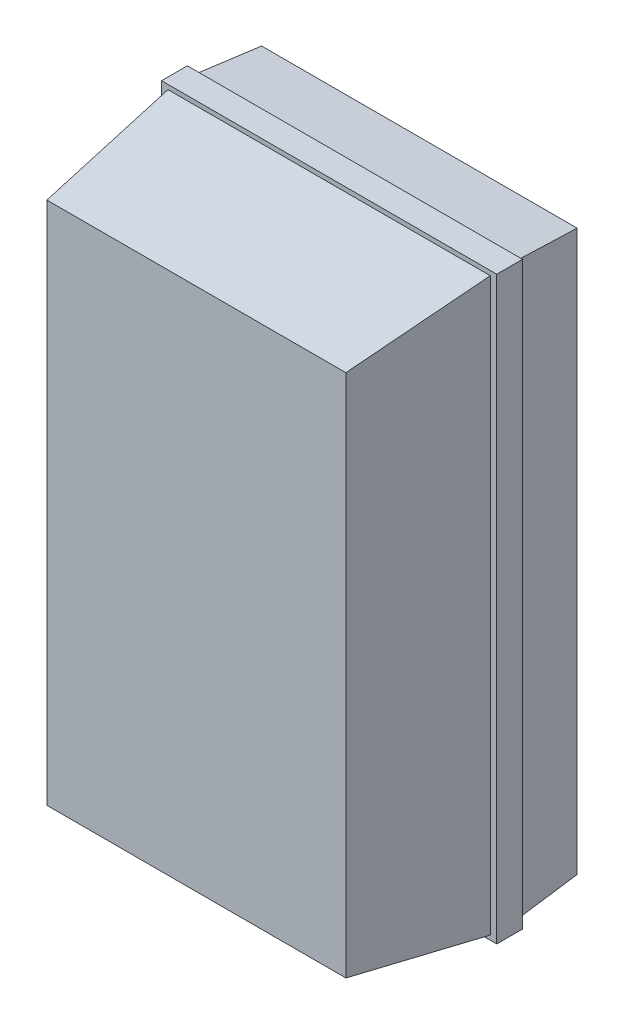
ISO-10303-21;
HEADER;
FILE_DESCRIPTION(('STEP AP214'),'2;1');
FILE_NAME('part.step','',(''),(''),'','','');
FILE_SCHEMA(('AUTOMOTIVE_DESIGN { 1 0 10303 214 1 1 1 1 }'));
ENDSEC;
DATA;
#1=APPLICATION_CONTEXT('core data for automotive mechanical design processes');
#2=APPLICATION_PROTOCOL_DEFINITION('international standard','automotive_design',2000,#1);
#3=PRODUCT_CONTEXT('',#1,'mechanical');
#4=PRODUCT('Part','Part','',(#3));
#5=PRODUCT_RELATED_PRODUCT_CATEGORY('part','',(#4));
#6=PRODUCT_DEFINITION_FORMATION('','',#4);
#7=PRODUCT_DEFINITION_CONTEXT('part definition',#1,'design');
#8=PRODUCT_DEFINITION('design','',#6,#7);
#9=PRODUCT_DEFINITION_SHAPE('','',#8);
#10=(LENGTH_UNIT() NAMED_UNIT(*) SI_UNIT(.MILLI.,.METRE.));
#11=(NAMED_UNIT(*) PLANE_ANGLE_UNIT() SI_UNIT($,.RADIAN.));
#12=(NAMED_UNIT(*) SI_UNIT($,.STERADIAN.) SOLID_ANGLE_UNIT());
#13=UNCERTAINTY_MEASURE_WITH_UNIT(LENGTH_MEASURE(1.E-05),#10,'distance_accuracy_value','');
#14=(GEOMETRIC_REPRESENTATION_CONTEXT(3) GLOBAL_UNCERTAINTY_ASSIGNED_CONTEXT((#13)) GLOBAL_UNIT_ASSIGNED_CONTEXT((#10,
#11,#12)) REPRESENTATION_CONTEXT('',''));
#15=CARTESIAN_POINT('',(0.,0.,0.));
#16=DIRECTION('',(0.,0.,1.));
#17=DIRECTION('',(1.,0.,0.));
#18=AXIS2_PLACEMENT_3D('',#15,#16,#17);
#19=CARTESIAN_POINT('',(43.94011332343,16.96,3.7));
#20=DIRECTION('',(0.,0.,-1.));
#21=DIRECTION('',(0.,-1.,0.));
#22=AXIS2_PLACEMENT_3D('',#19,#20,#21);
#23=PLANE('',#22);
#24=DIRECTION('',(-1.,0.,0.));
#25=VECTOR('',#24,1.);
#26=CARTESIAN_POINT('',(46.25988667658,17.17661679014,3.70000000001));
#27=LINE('',#26,#25);
#28=CARTESIAN_POINT('',(46.25988667657,17.17661679013,3.7));
#29=VERTEX_POINT('',#28);
#30=CARTESIAN_POINT('',(43.94011332343,17.17661679013,3.7));
#31=VERTEX_POINT('',#30);
#32=EDGE_CURVE('E41',#29,#31,#27,.T.);
#33=ORIENTED_EDGE('',*,*,#32,.F.);
#34=DIRECTION('',(0.,-1.,0.));
#35=VECTOR('',#34,1.);
#36=CARTESIAN_POINT('',(46.25988667658,21.24338320988,3.70000000001));
#37=LINE('',#36,#35);
#38=CARTESIAN_POINT('',(46.25988667657,21.24338320987,3.7));
#39=VERTEX_POINT('',#38);
#40=EDGE_CURVE('E183',#39,#29,#37,.T.);
#41=ORIENTED_EDGE('',*,*,#40,.F.);
#42=DIRECTION('',(1.,0.,0.));
#43=VECTOR('',#42,1.);
#44=CARTESIAN_POINT('',(43.94011332344,21.24338320988,3.70000000001));
#45=LINE('',#44,#43);
#46=CARTESIAN_POINT('',(43.94011332343,21.24338320987,3.7));
#47=VERTEX_POINT('',#46);
#48=EDGE_CURVE('E28',#47,#39,#45,.T.);
#49=ORIENTED_EDGE('',*,*,#48,.F.);
#50=DIRECTION('',(0.,1.,0.));
#51=VECTOR('',#50,1.);
#52=CARTESIAN_POINT('',(43.94011332344,17.17661679014,3.70000000001));
#53=LINE('',#52,#51);
#54=EDGE_CURVE('E11',#31,#47,#53,.T.);
#55=ORIENTED_EDGE('',*,*,#54,.F.);
#56=EDGE_LOOP('',(#33,#41,#49,#55));
#57=FACE_BOUND('',#56,.T.);
#58=ADVANCED_FACE('F17',(#57),#23,.F.);
#59=CARTESIAN_POINT('',(43.85,16.96,2.67));
#60=DIRECTION('',(0.996194698091745,0.,-0.0871557427476639));
#61=DIRECTION('',(0.,-1.,0.));
#62=AXIS2_PLACEMENT_3D('',#59,#60,#61);
#63=PLANE('',#62);
#64=DIRECTION('',(0.,1.,0.));
#65=VECTOR('',#64,1.);
#66=CARTESIAN_POINT('',(43.85000000001,16.99500000001,2.67000000001));
#67=LINE('',#66,#65);
#68=CARTESIAN_POINT('',(43.85,16.995,2.67));
#69=VERTEX_POINT('',#68);
#70=CARTESIAN_POINT('',(43.85,21.425,2.67));
#71=VERTEX_POINT('',#70);
#72=EDGE_CURVE('E218',#69,#71,#67,.T.);
#73=ORIENTED_EDGE('',*,*,#72,.F.);
#74=DIRECTION('',(-0.085841482794141,-0.173007208817381,-0.981172637984225));
#75=VECTOR('',#74,1.);
#76=CARTESIAN_POINT('',(43.94011332344,17.17661679014,3.70000000001));
#77=LINE('',#76,#75);
#78=EDGE_CURVE('E184',#31,#69,#77,.T.);
#79=ORIENTED_EDGE('',*,*,#78,.F.);
#80=ORIENTED_EDGE('',*,*,#54,.T.);
#81=DIRECTION('',(0.085841482794141,-0.173007208817381,0.981172637984225));
#82=VECTOR('',#81,1.);
#83=CARTESIAN_POINT('',(43.85000000001,21.42500000001,2.67000000001));
#84=LINE('',#83,#82);
#85=EDGE_CURVE('E223',#71,#47,#84,.T.);
#86=ORIENTED_EDGE('',*,*,#85,.F.);
#87=EDGE_LOOP('',(#73,#79,#80,#86));
#88=FACE_BOUND('',#87,.T.);
#89=ADVANCED_FACE('F280',(#88),#63,.F.);
#90=CARTESIAN_POINT('',(43.8,21.24338320987,3.7));
#91=DIRECTION('',(0.,-0.984807753012213,-0.173648177666903));
#92=DIRECTION('',(0.,0.173648177666903,-0.984807753012213));
#93=AXIS2_PLACEMENT_3D('',#90,#91,#92);
#94=PLANE('',#93);
#95=ORIENTED_EDGE('',*,*,#48,.T.);
#96=DIRECTION('',(0.085841482794141,0.173007208817381,-0.981172637984225));
#97=VECTOR('',#96,1.);
#98=CARTESIAN_POINT('',(46.25988667658,21.24338320988,3.70000000001));
#99=LINE('',#98,#97);
#100=CARTESIAN_POINT('',(46.35,21.425,2.67));
#101=VERTEX_POINT('',#100);
#102=EDGE_CURVE('E215',#39,#101,#99,.T.);
#103=ORIENTED_EDGE('',*,*,#102,.T.);
#104=DIRECTION('',(1.,0.,0.));
#105=VECTOR('',#104,1.);
#106=CARTESIAN_POINT('',(43.85000000001,21.42500000001,2.67000000001));
#107=LINE('',#106,#105);
#108=EDGE_CURVE('E94',#71,#101,#107,.T.);
#109=ORIENTED_EDGE('',*,*,#108,.F.);
#110=ORIENTED_EDGE('',*,*,#85,.T.);
#111=EDGE_LOOP('',(#95,#103,#109,#110));
#112=FACE_BOUND('',#111,.T.);
#113=ADVANCED_FACE('F278',(#112),#94,.F.);
#114=CARTESIAN_POINT('',(43.8,16.96,2.67));
#115=DIRECTION('',(0.,0.,-1.));
#116=DIRECTION('',(0.,-1.,0.));
#117=AXIS2_PLACEMENT_3D('',#114,#115,#116);
#118=PLANE('',#117);
#119=DIRECTION('',(0.,1.,0.));
#120=VECTOR('',#119,1.);
#121=CARTESIAN_POINT('',(43.80000000001,16.96000000001,2.67000000001));
#122=LINE('',#121,#120);
#123=CARTESIAN_POINT('',(43.8,16.96,2.67));
#124=VERTEX_POINT('',#123);
#125=CARTESIAN_POINT('',(43.8,21.46,2.67));
#126=VERTEX_POINT('',#125);
#127=EDGE_CURVE('E106',#124,#126,#122,.T.);
#128=ORIENTED_EDGE('',*,*,#127,.F.);
#129=DIRECTION('',(1.,0.,0.));
#130=VECTOR('',#129,1.);
#131=CARTESIAN_POINT('',(43.80000000001,16.96000000001,2.67000000001));
#132=LINE('',#131,#130);
#133=CARTESIAN_POINT('',(46.4,16.96,2.67));
#134=VERTEX_POINT('',#133);
#135=EDGE_CURVE('E238',#124,#134,#132,.T.);
#136=ORIENTED_EDGE('',*,*,#135,.T.);
#137=DIRECTION('',(0.,-1.,0.));
#138=VECTOR('',#137,1.);
#139=CARTESIAN_POINT('',(46.40000000001,21.46000000001,2.67000000001));
#140=LINE('',#139,#138);
#141=CARTESIAN_POINT('',(46.4,21.46,2.67));
#142=VERTEX_POINT('',#141);
#143=EDGE_CURVE('E200',#142,#134,#140,.T.);
#144=ORIENTED_EDGE('',*,*,#143,.F.);
#145=DIRECTION('',(1.,0.,0.));
#146=VECTOR('',#145,1.);
#147=CARTESIAN_POINT('',(43.80000000001,21.46000000001,2.67000000001));
#148=LINE('',#147,#146);
#149=EDGE_CURVE('E239',#126,#142,#148,.T.);
#150=ORIENTED_EDGE('',*,*,#149,.F.);
#151=EDGE_LOOP('',(#128,#136,#144,#150));
#152=FACE_BOUND('',#151,.T.);
#153=DIRECTION('',(-1.,0.,0.));
#154=VECTOR('',#153,1.);
#155=CARTESIAN_POINT('',(46.35000000001,16.99500000001,2.67000000001));
#156=LINE('',#155,#154);
#157=CARTESIAN_POINT('',(46.35,16.995,2.67));
#158=VERTEX_POINT('',#157);
#159=EDGE_CURVE('E176',#158,#69,#156,.T.);
#160=ORIENTED_EDGE('',*,*,#159,.T.);
#161=ORIENTED_EDGE('',*,*,#72,.T.);
#162=ORIENTED_EDGE('',*,*,#108,.T.);
#163=DIRECTION('',(0.,-1.,0.));
#164=VECTOR('',#163,1.);
#165=CARTESIAN_POINT('',(46.35000000001,21.42500000001,2.67000000001));
#166=LINE('',#165,#164);
#167=EDGE_CURVE('E242',#101,#158,#166,.T.);
#168=ORIENTED_EDGE('',*,*,#167,.T.);
#169=EDGE_LOOP('',(#160,#161,#162,#168));
#170=FACE_BOUND('',#169,.T.);
#171=ADVANCED_FACE('F266',(#152,#170),#118,.F.);
#172=CARTESIAN_POINT('',(43.8,21.46,2.67));
#173=DIRECTION('',(0.,-1.,0.));
#174=DIRECTION('',(0.,0.,-1.));
#175=AXIS2_PLACEMENT_3D('',#172,#173,#174);
#176=PLANE('',#175);
#177=ORIENTED_EDGE('',*,*,#149,.T.);
#178=DIRECTION('',(0.,0.,-1.));
#179=VECTOR('',#178,1.);
#180=CARTESIAN_POINT('',(46.40000000001,21.46000000001,2.67000000001));
#181=LINE('',#180,#179);
#182=CARTESIAN_POINT('',(46.4,21.46,2.47));
#183=VERTEX_POINT('',#182);
#184=EDGE_CURVE('E211',#142,#183,#181,.T.);
#185=ORIENTED_EDGE('',*,*,#184,.T.);
#186=DIRECTION('',(1.,0.,0.));
#187=VECTOR('',#186,1.);
#188=CARTESIAN_POINT('',(43.80000000001,21.46000000001,2.47000000001));
#189=LINE('',#188,#187);
#190=CARTESIAN_POINT('',(43.8,21.46,2.47));
#191=VERTEX_POINT('',#190);
#192=EDGE_CURVE('E185',#191,#183,#189,.T.);
#193=ORIENTED_EDGE('',*,*,#192,.F.);
#194=DIRECTION('',(0.,0.,-1.));
#195=VECTOR('',#194,1.);
#196=CARTESIAN_POINT('',(43.80000000001,21.46000000001,2.67000000001));
#197=LINE('',#196,#195);
#198=EDGE_CURVE('E234',#126,#191,#197,.T.);
#199=ORIENTED_EDGE('',*,*,#198,.F.);
#200=EDGE_LOOP('',(#177,#185,#193,#199));
#201=FACE_BOUND('',#200,.T.);
#202=ADVANCED_FACE('F306',(#201),#176,.F.);
#203=CARTESIAN_POINT('',(43.8,16.96,2.67));
#204=DIRECTION('',(1.,0.,0.));
#205=DIRECTION('',(0.,1.,0.));
#206=AXIS2_PLACEMENT_3D('',#203,#204,#205);
#207=PLANE('',#206);
#208=DIRECTION('',(0.,0.,1.));
#209=VECTOR('',#208,1.);
#210=CARTESIAN_POINT('',(43.80000000001,16.96000000001,2.47000000001));
#211=LINE('',#210,#209);
#212=CARTESIAN_POINT('',(43.8,16.96,2.47));
#213=VERTEX_POINT('',#212);
#214=EDGE_CURVE('E233',#213,#124,#211,.T.);
#215=ORIENTED_EDGE('',*,*,#214,.T.);
#216=ORIENTED_EDGE('',*,*,#127,.T.);
#217=ORIENTED_EDGE('',*,*,#198,.T.);
#218=DIRECTION('',(0.,1.,0.));
#219=VECTOR('',#218,1.);
#220=CARTESIAN_POINT('',(43.80000000001,16.96000000001,2.47000000001));
#221=LINE('',#220,#219);
#222=EDGE_CURVE('E187',#213,#191,#221,.T.);
#223=ORIENTED_EDGE('',*,*,#222,.F.);
#224=EDGE_LOOP('',(#215,#216,#217,#223));
#225=FACE_BOUND('',#224,.T.);
#226=ADVANCED_FACE('F300',(#225),#207,.F.);
#227=CARTESIAN_POINT('',(46.4,16.96,2.47));
#228=DIRECTION('',(0.,0.,1.));
#229=DIRECTION('',(1.,0.,0.));
#230=AXIS2_PLACEMENT_3D('',#227,#228,#229);
#231=PLANE('',#230);
#232=DIRECTION('',(0.,-1.,0.));
#233=VECTOR('',#232,1.);
#234=CARTESIAN_POINT('',(46.40000000001,21.46000000001,2.47000000001));
#235=LINE('',#234,#233);
#236=CARTESIAN_POINT('',(46.4,16.96,2.47));
#237=VERTEX_POINT('',#236);
#238=EDGE_CURVE('E250',#183,#237,#235,.T.);
#239=ORIENTED_EDGE('',*,*,#238,.T.);
#240=DIRECTION('',(-1.,0.,0.));
#241=VECTOR('',#240,1.);
#242=CARTESIAN_POINT('',(46.40000000001,16.96000000001,2.47000000001));
#243=LINE('',#242,#241);
#244=EDGE_CURVE('E197',#237,#213,#243,.T.);
#245=ORIENTED_EDGE('',*,*,#244,.T.);
#246=ORIENTED_EDGE('',*,*,#222,.T.);
#247=ORIENTED_EDGE('',*,*,#192,.T.);
#248=EDGE_LOOP('',(#239,#245,#246,#247));
#249=FACE_BOUND('',#248,.T.);
#250=DIRECTION('',(-1.,0.,0.));
#251=VECTOR('',#250,1.);
#252=CARTESIAN_POINT('',(46.35000000001,16.99500000001,2.47000000001));
#253=LINE('',#252,#251);
#254=CARTESIAN_POINT('',(46.35,16.995,2.47));
#255=VERTEX_POINT('',#254);
#256=CARTESIAN_POINT('',(43.85,16.995,2.47));
#257=VERTEX_POINT('',#256);
#258=EDGE_CURVE('E133',#255,#257,#253,.T.);
#259=ORIENTED_EDGE('',*,*,#258,.F.);
#260=DIRECTION('',(0.,-1.,0.));
#261=VECTOR('',#260,1.);
#262=CARTESIAN_POINT('',(46.35000000001,21.42500000001,2.47000000001));
#263=LINE('',#262,#261);
#264=CARTESIAN_POINT('',(46.35,21.425,2.47));
#265=VERTEX_POINT('',#264);
#266=EDGE_CURVE('E21',#265,#255,#263,.T.);
#267=ORIENTED_EDGE('',*,*,#266,.F.);
#268=DIRECTION('',(1.,0.,0.));
#269=VECTOR('',#268,1.);
#270=CARTESIAN_POINT('',(43.85000000001,21.42500000001,2.47000000001));
#271=LINE('',#270,#269);
#272=CARTESIAN_POINT('',(43.85,21.425,2.47));
#273=VERTEX_POINT('',#272);
#274=EDGE_CURVE('E162',#273,#265,#271,.T.);
#275=ORIENTED_EDGE('',*,*,#274,.F.);
#276=DIRECTION('',(0.,1.,0.));
#277=VECTOR('',#276,1.);
#278=CARTESIAN_POINT('',(43.85000000001,16.99500000001,2.47000000001));
#279=LINE('',#278,#277);
#280=EDGE_CURVE('E158',#257,#273,#279,.T.);
#281=ORIENTED_EDGE('',*,*,#280,.F.);
#282=EDGE_LOOP('',(#259,#267,#275,#281));
#283=FACE_BOUND('',#282,.T.);
#284=ADVANCED_FACE('F296',(#249,#283),#231,.F.);
#285=CARTESIAN_POINT('',(43.8,16.96,2.67));
#286=DIRECTION('',(0.,-1.,0.));
#287=DIRECTION('',(0.,0.,-1.));
#288=AXIS2_PLACEMENT_3D('',#285,#286,#287);
#289=PLANE('',#288);
#290=DIRECTION('',(0.,0.,-1.));
#291=VECTOR('',#290,1.);
#292=CARTESIAN_POINT('',(46.40000000001,16.96000000001,2.67000000001));
#293=LINE('',#292,#291);
#294=EDGE_CURVE('E188',#134,#237,#293,.T.);
#295=ORIENTED_EDGE('',*,*,#294,.F.);
#296=ORIENTED_EDGE('',*,*,#135,.F.);
#297=ORIENTED_EDGE('',*,*,#214,.F.);
#298=ORIENTED_EDGE('',*,*,#244,.F.);
#299=EDGE_LOOP('',(#295,#296,#297,#298));
#300=FACE_BOUND('',#299,.T.);
#301=ADVANCED_FACE('F299',(#300),#289,.T.);
#302=CARTESIAN_POINT('',(46.4,16.96,2.67));
#303=DIRECTION('',(-1.,0.,0.));
#304=DIRECTION('',(0.,0.,1.));
#305=AXIS2_PLACEMENT_3D('',#302,#303,#304);
#306=PLANE('',#305);
#307=ORIENTED_EDGE('',*,*,#294,.T.);
#308=ORIENTED_EDGE('',*,*,#238,.F.);
#309=ORIENTED_EDGE('',*,*,#184,.F.);
#310=ORIENTED_EDGE('',*,*,#143,.T.);
#311=EDGE_LOOP('',(#307,#308,#309,#310));
#312=FACE_BOUND('',#311,.T.);
#313=ADVANCED_FACE('F303',(#312),#306,.F.);
#314=CARTESIAN_POINT('',(43.85,16.96,2.47));
#315=DIRECTION('',(0.998629534754574,0.,0.0523359562429386));
#316=DIRECTION('',(0.,-1.,0.));
#317=AXIS2_PLACEMENT_3D('',#314,#315,#316);
#318=PLANE('',#317);
#319=DIRECTION('',(0.,1.,0.));
#320=VECTOR('',#319,1.);
#321=CARTESIAN_POINT('',(43.87620388965,17.03874433177,1.97000000001));
#322=LINE('',#321,#320);
#323=CARTESIAN_POINT('',(43.87620388964,17.03874433176,1.97));
#324=VERTEX_POINT('',#323);
#325=CARTESIAN_POINT('',(43.87620388964,21.38125566824,1.97));
#326=VERTEX_POINT('',#325);
#327=EDGE_CURVE('E142',#324,#326,#322,.T.);
#328=ORIENTED_EDGE('',*,*,#327,.F.);
#329=DIRECTION('',(-0.0521373445397926,-0.0870372043097466,0.994839797339392));
#330=VECTOR('',#329,1.);
#331=CARTESIAN_POINT('',(43.87620388965,17.03874433177,1.97000000001));
#332=LINE('',#331,#330);
#333=EDGE_CURVE('E207',#324,#257,#332,.T.);
#334=ORIENTED_EDGE('',*,*,#333,.T.);
#335=ORIENTED_EDGE('',*,*,#280,.T.);
#336=DIRECTION('',(0.0521373445397823,-0.0870372043098161,-0.994839797339386));
#337=VECTOR('',#336,1.);
#338=CARTESIAN_POINT('',(43.85000000001,21.42500000001,2.47000000001));
#339=LINE('',#338,#337);
#340=EDGE_CURVE('E156',#273,#326,#339,.T.);
#341=ORIENTED_EDGE('',*,*,#340,.T.);
#342=EDGE_LOOP('',(#328,#334,#335,#341));
#343=FACE_BOUND('',#342,.T.);
#344=ADVANCED_FACE('F157',(#343),#318,.F.);
#345=CARTESIAN_POINT('',(43.8,21.425,2.47));
#346=DIRECTION('',(0.,-0.996194698091745,0.0871557427476639));
#347=DIRECTION('',(-1.,0.,0.));
#348=AXIS2_PLACEMENT_3D('',#345,#346,#347);
#349=PLANE('',#348);
#350=DIRECTION('',(1.,0.,0.));
#351=VECTOR('',#350,1.);
#352=CARTESIAN_POINT('',(43.87620388965,21.38125566825,1.97000000001));
#353=LINE('',#352,#351);
#354=CARTESIAN_POINT('',(46.32379611036,21.38125566824,1.97));
#355=VERTEX_POINT('',#354);
#356=EDGE_CURVE('E148',#326,#355,#353,.T.);
#357=ORIENTED_EDGE('',*,*,#356,.F.);
#358=ORIENTED_EDGE('',*,*,#340,.F.);
#359=ORIENTED_EDGE('',*,*,#274,.T.);
#360=DIRECTION('',(-0.0521373445397624,-0.0870372043098163,-0.994839797339387));
#361=VECTOR('',#360,1.);
#362=CARTESIAN_POINT('',(46.35000000001,21.42500000001,2.47000000001));
#363=LINE('',#362,#361);
#364=EDGE_CURVE('E166',#265,#355,#363,.T.);
#365=ORIENTED_EDGE('',*,*,#364,.T.);
#366=EDGE_LOOP('',(#357,#358,#359,#365));
#367=FACE_BOUND('',#366,.T.);
#368=ADVANCED_FACE('F164',(#367),#349,.F.);
#369=CARTESIAN_POINT('',(46.35,16.96,2.47));
#370=DIRECTION('',(-0.998629534754574,0.,0.0523359562429386));
#371=DIRECTION('',(0.,1.,0.));
#372=AXIS2_PLACEMENT_3D('',#369,#370,#371);
#373=PLANE('',#372);
#374=ORIENTED_EDGE('',*,*,#266,.T.);
#375=DIRECTION('',(-0.0521373445397627,0.0870372043097468,-0.994839797339394));
#376=VECTOR('',#375,1.);
#377=CARTESIAN_POINT('',(46.35000000001,16.99500000001,2.47000000001));
#378=LINE('',#377,#376);
#379=CARTESIAN_POINT('',(46.32379611036,17.03874433176,1.97));
#380=VERTEX_POINT('',#379);
#381=EDGE_CURVE('E181',#255,#380,#378,.T.);
#382=ORIENTED_EDGE('',*,*,#381,.T.);
#383=DIRECTION('',(0.,-1.,0.));
#384=VECTOR('',#383,1.);
#385=CARTESIAN_POINT('',(46.32379611037,21.38125566825,1.97000000001));
#386=LINE('',#385,#384);
#387=EDGE_CURVE('E178',#355,#380,#386,.T.);
#388=ORIENTED_EDGE('',*,*,#387,.F.);
#389=ORIENTED_EDGE('',*,*,#364,.F.);
#390=EDGE_LOOP('',(#374,#382,#388,#389));
#391=FACE_BOUND('',#390,.T.);
#392=ADVANCED_FACE('F19',(#391),#373,.F.);
#393=CARTESIAN_POINT('',(43.87620388964,16.96,1.97));
#394=DIRECTION('',(0.,0.,1.));
#395=DIRECTION('',(1.,0.,0.));
#396=AXIS2_PLACEMENT_3D('',#393,#394,#395);
#397=PLANE('',#396);
#398=ORIENTED_EDGE('',*,*,#387,.T.);
#399=DIRECTION('',(-1.,4.09580848919922E-12,0.));
#400=VECTOR('',#399,1.);
#401=CARTESIAN_POINT('',(46.32379611037,17.03874433177,1.97000000001));
#402=LINE('',#401,#400);
#403=EDGE_CURVE('E151',#380,#324,#402,.T.);
#404=ORIENTED_EDGE('',*,*,#403,.T.);
#405=ORIENTED_EDGE('',*,*,#327,.T.);
#406=ORIENTED_EDGE('',*,*,#356,.T.);
#407=EDGE_LOOP('',(#398,#404,#405,#406));
#408=FACE_BOUND('',#407,.T.);
#409=ADVANCED_FACE('F146',(#408),#397,.F.);
#410=CARTESIAN_POINT('',(43.8,16.995,2.47));
#411=DIRECTION('',(0.,0.996194698091745,0.0871557427476639));
#412=DIRECTION('',(1.,0.,0.));
#413=AXIS2_PLACEMENT_3D('',#410,#411,#412);
#414=PLANE('',#413);
#415=ORIENTED_EDGE('',*,*,#258,.T.);
#416=ORIENTED_EDGE('',*,*,#333,.F.);
#417=ORIENTED_EDGE('',*,*,#403,.F.);
#418=ORIENTED_EDGE('',*,*,#381,.F.);
#419=EDGE_LOOP('',(#415,#416,#417,#418));
#420=FACE_BOUND('',#419,.T.);
#421=ADVANCED_FACE('F295',(#420),#414,.F.);
#422=CARTESIAN_POINT('',(46.35,16.96,2.67));
#423=DIRECTION('',(-0.996194698091745,0.,-0.0871557427476639));
#424=DIRECTION('',(-0.0871557427476639,0.,0.996194698091745));
#425=AXIS2_PLACEMENT_3D('',#422,#423,#424);
#426=PLANE('',#425);
#427=DIRECTION('',(0.0858414827941311,-0.173007208817381,-0.981172637984226));
#428=VECTOR('',#427,1.);
#429=CARTESIAN_POINT('',(46.25988667658,17.17661679014,3.70000000001));
#430=LINE('',#429,#428);
#431=EDGE_CURVE('E172',#29,#158,#430,.T.);
#432=ORIENTED_EDGE('',*,*,#431,.T.);
#433=ORIENTED_EDGE('',*,*,#167,.F.);
#434=ORIENTED_EDGE('',*,*,#102,.F.);
#435=ORIENTED_EDGE('',*,*,#40,.T.);
#436=EDGE_LOOP('',(#432,#433,#434,#435));
#437=FACE_BOUND('',#436,.T.);
#438=ADVANCED_FACE('F275',(#437),#426,.F.);
#439=CARTESIAN_POINT('',(43.8,17.17661679013,3.7));
#440=DIRECTION('',(0.,0.984807753012213,-0.173648177666903));
#441=DIRECTION('',(-1.,0.,0.));
#442=AXIS2_PLACEMENT_3D('',#439,#440,#441);
#443=PLANE('',#442);
#444=ORIENTED_EDGE('',*,*,#159,.F.);
#445=ORIENTED_EDGE('',*,*,#431,.F.);
#446=ORIENTED_EDGE('',*,*,#32,.T.);
#447=ORIENTED_EDGE('',*,*,#78,.T.);
#448=EDGE_LOOP('',(#444,#445,#446,#447));
#449=FACE_BOUND('',#448,.T.);
#450=ADVANCED_FACE('F272',(#449),#443,.F.);
#451=CLOSED_SHELL('',(#58,#89,#113,#171,#202,#226,#284,#301,#313,#344,#368,#392,#409,#421,#438,#450));
#452=MANIFOLD_SOLID_BREP('B1',#451);
#453=ADVANCED_BREP_SHAPE_REPRESENTATION('',(#18,#452),#14);
#454=SHAPE_DEFINITION_REPRESENTATION(#9,#453);
ENDSEC;
END-ISO-10303-21;
